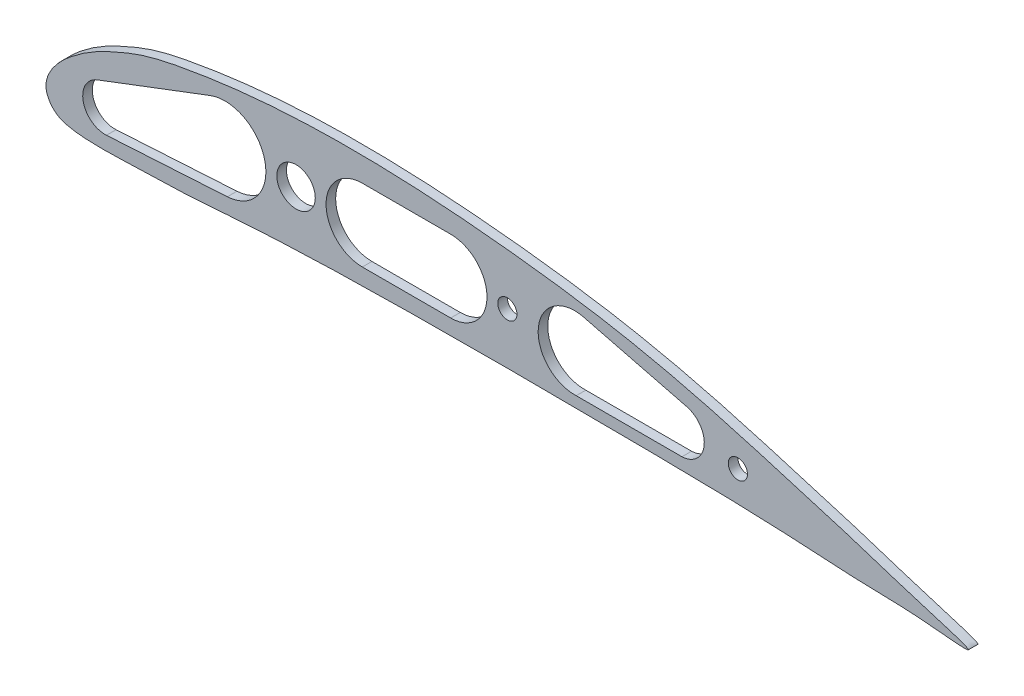
ISO-10303-21;
HEADER;
FILE_DESCRIPTION(('STEP AP214'),'2;1');
FILE_NAME('part.step','',(''),(''),'','','');
FILE_SCHEMA(('AUTOMOTIVE_DESIGN { 1 0 10303 214 1 1 1 1 }'));
ENDSEC;
DATA;
#1=APPLICATION_CONTEXT('core data for automotive mechanical design processes');
#2=APPLICATION_PROTOCOL_DEFINITION('international standard','automotive_design',2000,#1);
#3=PRODUCT_CONTEXT('',#1,'mechanical');
#4=PRODUCT('Part','Part','',(#3));
#5=PRODUCT_RELATED_PRODUCT_CATEGORY('part','',(#4));
#6=PRODUCT_DEFINITION_FORMATION('','',#4);
#7=PRODUCT_DEFINITION_CONTEXT('part definition',#1,'design');
#8=PRODUCT_DEFINITION('design','',#6,#7);
#9=PRODUCT_DEFINITION_SHAPE('','',#8);
#10=(LENGTH_UNIT() NAMED_UNIT(*) SI_UNIT(.MILLI.,.METRE.));
#11=(NAMED_UNIT(*) PLANE_ANGLE_UNIT() SI_UNIT($,.RADIAN.));
#12=(NAMED_UNIT(*) SI_UNIT($,.STERADIAN.) SOLID_ANGLE_UNIT());
#13=UNCERTAINTY_MEASURE_WITH_UNIT(LENGTH_MEASURE(1.E-05),#10,'distance_accuracy_value','');
#14=(GEOMETRIC_REPRESENTATION_CONTEXT(3) GLOBAL_UNCERTAINTY_ASSIGNED_CONTEXT((#13)) GLOBAL_UNIT_ASSIGNED_CONTEXT((#10,
#11,#12)) REPRESENTATION_CONTEXT('',''));
#15=CARTESIAN_POINT('',(0.,0.,0.));
#16=DIRECTION('',(0.,0.,1.));
#17=DIRECTION('',(1.,0.,0.));
#18=AXIS2_PLACEMENT_3D('',#15,#16,#17);
#19=CARTESIAN_POINT('',(304.8,0.,-1.5875));
#20=CARTESIAN_POINT('',(305.077640244681,0.670235949008001,-1.5875));
#21=CARTESIAN_POINT('',(287.206651557549,5.72014346783749,-1.5875));
#22=CARTESIAN_POINT('',(270.662795429074,11.3970544887587,-1.5875));
#23=CARTESIAN_POINT('',(243.463273841648,19.4859206004711,-1.5875));
#24=CARTESIAN_POINT('',(213.747912644984,28.2099572247865,-1.5875));
#25=CARTESIAN_POINT('',(183.040246215652,34.6765948811052,-1.5875));
#26=CARTESIAN_POINT('',(152.4919465254,38.6289899500206,-1.5875));
#27=CARTESIAN_POINT('',(121.966980876844,41.172895409398,-1.5875));
#28=CARTESIAN_POINT('',(91.4149280659883,41.7230127486465,-1.5875));
#29=CARTESIAN_POINT('',(65.9274954962046,40.0620135064187,-1.5875));
#30=CARTESIAN_POINT('',(45.6250038216973,37.0045999100277,-1.5875));
#31=CARTESIAN_POINT('',(32.7277103548807,34.3521427962271,-1.5875));
#32=CARTESIAN_POINT('',(22.7317956157464,30.1965290437229,-1.5875));
#33=CARTESIAN_POINT('',(14.9072257071245,26.4612505881115,-1.5875));
#34=CARTESIAN_POINT('',(8.51628352714233,21.9644178457254,-1.5875));
#35=CARTESIAN_POINT('',(2.53745558093638,16.4884644553953,-1.5875));
#36=CARTESIAN_POINT('',(-1.96447989389202,8.89390689304449,-1.5875));
#37=CARTESIAN_POINT('',(2.84193009807859,2.33492302764709,-1.5875));
#38=CARTESIAN_POINT('',(8.77882949074113,0.629027732179887,-1.5875));
#39=CARTESIAN_POINT('',(15.2287936628024,0.221834685012508,-1.5875));
#40=CARTESIAN_POINT('',(22.8635764639965,0.239109805904665,-1.5875));
#41=CARTESIAN_POINT('',(33.0156316728747,0.788100741553244,-1.5875));
#42=CARTESIAN_POINT('',(45.7404190780474,0.855312608130182,-1.5875));
#43=CARTESIAN_POINT('',(66.0183969786535,2.65839434977953,-1.5875));
#44=CARTESIAN_POINT('',(91.4265780864865,3.79492631367271,-1.5875));
#45=CARTESIAN_POINT('',(121.915270130211,4.33221739110161,-1.5875));
#46=CARTESIAN_POINT('',(152.408348669622,4.47906680792443,-1.5875));
#47=CARTESIAN_POINT('',(182.849810214161,4.26910364888094,-1.5875));
#48=CARTESIAN_POINT('',(213.479164171133,4.04767027141658,-1.5875));
#49=CARTESIAN_POINT('',(243.430144591887,3.31397178943146,-1.5875));
#50=CARTESIAN_POINT('',(270.486497521151,1.37051361290602,-1.5875));
#51=CARTESIAN_POINT('',(287.394329758651,1.44240402655394,-1.5875));
#52=CARTESIAN_POINT('',(304.536665056553,-0.635702313008765,-1.5875));
#53=CARTESIAN_POINT('',(304.8,0.,-1.5875));
#54=B_SPLINE_CURVE_WITH_KNOTS('',3,(#19,#20,#21,#22,#23,#24,#25,#26,#27,#28,#29,#30,#31,#32,#33,
#34,#35,#36,#37,#38,#39,#40,#41,#42,#43,#44,#45,#46,#47,#48,#49,#50,#51,#52,#53),.UNSPECIFIED.,
.T.,.F.,(4,1,1,1,1,1,1,1,1,1,1,1,1,1,1,1,1,1,1,1,1,1,1,1,1,1,1,1,1,1,1,1,4),(0.,
0.0255560444991772,0.050960447010779,0.101552747326171,0.151805437773323,0.201252492284918,
0.250083001864764,0.298629140589189,0.347026117124877,0.395536064294317,0.420002518911991,
0.444885367904301,0.457915186872697,0.47144103148067,0.486208379890319,0.494593530866719,
0.510948222410887,0.521394630718682,0.527823605666163,0.539981827808652,0.552079711007262,
0.564187268644203,0.588393920687583,0.612648894272303,0.661100878724036,0.709502088857399,
0.75789422654222,0.80628636422704,0.854680316537635,0.903093620624395,0.951545605076128,
0.975760720350009,1.),.UNSPECIFIED.);
#55=DIRECTION('',(0.,0.,1.));
#56=VECTOR('',#55,1.);
#57=SURFACE_OF_LINEAR_EXTRUSION('',#54,#56);
#58=CARTESIAN_POINT('',(304.8,0.,-1.5875));
#59=VERTEX_POINT('',#58);
#60=EDGE_CURVE('E12',#59,#59,#54,.T.);
#61=ORIENTED_EDGE('',*,*,#60,.T.);
#62=EDGE_LOOP('',(#61));
#63=FACE_BOUND('',#62,.T.);
#64=CARTESIAN_POINT('',(304.8,0.,1.5875));
#65=CARTESIAN_POINT('',(305.077640244681,0.670235949008001,1.5875));
#66=CARTESIAN_POINT('',(287.206651557549,5.72014346783749,1.5875));
#67=CARTESIAN_POINT('',(270.662795429074,11.3970544887587,1.5875));
#68=CARTESIAN_POINT('',(243.463273841648,19.4859206004711,1.5875));
#69=CARTESIAN_POINT('',(213.747912644984,28.2099572247865,1.5875));
#70=CARTESIAN_POINT('',(183.040246215652,34.6765948811052,1.5875));
#71=CARTESIAN_POINT('',(152.4919465254,38.6289899500206,1.5875));
#72=CARTESIAN_POINT('',(121.966980876844,41.172895409398,1.5875));
#73=CARTESIAN_POINT('',(91.4149280659883,41.7230127486465,1.5875));
#74=CARTESIAN_POINT('',(65.9274954962046,40.0620135064187,1.5875));
#75=CARTESIAN_POINT('',(45.6250038216973,37.0045999100277,1.5875));
#76=CARTESIAN_POINT('',(32.7277103548807,34.3521427962271,1.5875));
#77=CARTESIAN_POINT('',(22.7317956157464,30.1965290437229,1.5875));
#78=CARTESIAN_POINT('',(14.9072257071245,26.4612505881115,1.5875));
#79=CARTESIAN_POINT('',(8.51628352714233,21.9644178457254,1.5875));
#80=CARTESIAN_POINT('',(2.53745558093638,16.4884644553953,1.5875));
#81=CARTESIAN_POINT('',(-1.96447989389202,8.89390689304449,1.5875));
#82=CARTESIAN_POINT('',(2.84193009807859,2.33492302764709,1.5875));
#83=CARTESIAN_POINT('',(8.77882949074113,0.629027732179887,1.5875));
#84=CARTESIAN_POINT('',(15.2287936628024,0.221834685012508,1.5875));
#85=CARTESIAN_POINT('',(22.8635764639965,0.239109805904665,1.5875));
#86=CARTESIAN_POINT('',(33.0156316728747,0.788100741553244,1.5875));
#87=CARTESIAN_POINT('',(45.7404190780474,0.855312608130182,1.5875));
#88=CARTESIAN_POINT('',(66.0183969786535,2.65839434977953,1.5875));
#89=CARTESIAN_POINT('',(91.4265780864865,3.79492631367271,1.5875));
#90=CARTESIAN_POINT('',(121.915270130211,4.33221739110161,1.5875));
#91=CARTESIAN_POINT('',(152.408348669622,4.47906680792443,1.5875));
#92=CARTESIAN_POINT('',(182.849810214161,4.26910364888094,1.5875));
#93=CARTESIAN_POINT('',(213.479164171133,4.04767027141658,1.5875));
#94=CARTESIAN_POINT('',(243.430144591887,3.31397178943146,1.5875));
#95=CARTESIAN_POINT('',(270.486497521151,1.37051361290602,1.5875));
#96=CARTESIAN_POINT('',(287.394329758651,1.44240402655394,1.5875));
#97=CARTESIAN_POINT('',(304.536665056553,-0.635702313008765,1.5875));
#98=CARTESIAN_POINT('',(304.8,0.,1.5875));
#99=B_SPLINE_CURVE_WITH_KNOTS('',3,(#64,#65,#66,#67,#68,#69,#70,#71,#72,#73,#74,#75,#76,#77,#78,
#79,#80,#81,#82,#83,#84,#85,#86,#87,#88,#89,#90,#91,#92,#93,#94,#95,#96,#97,#98),.UNSPECIFIED.,
.T.,.F.,(4,1,1,1,1,1,1,1,1,1,1,1,1,1,1,1,1,1,1,1,1,1,1,1,1,1,1,1,1,1,1,1,4),(0.,
0.0255560444991772,0.050960447010779,0.101552747326171,0.151805437773323,0.201252492284918,
0.250083001864764,0.298629140589189,0.347026117124877,0.395536064294317,0.420002518911991,
0.444885367904301,0.457915186872697,0.47144103148067,0.486208379890319,0.494593530866719,
0.510948222410887,0.521394630718682,0.527823605666163,0.539981827808652,0.552079711007262,
0.564187268644203,0.588393920687583,0.612648894272303,0.661100878724036,0.709502088857399,
0.75789422654222,0.80628636422704,0.854680316537635,0.903093620624395,0.951545605076128,
0.975760720350009,1.),.UNSPECIFIED.);
#100=CARTESIAN_POINT('',(304.8,0.,1.5875));
#101=VERTEX_POINT('',#100);
#102=EDGE_CURVE('E299',#101,#101,#99,.T.);
#103=ORIENTED_EDGE('',*,*,#102,.F.);
#104=EDGE_LOOP('',(#103));
#105=FACE_BOUND('',#104,.T.);
#106=ADVANCED_FACE('F103',(#63,#105),#57,.T.);
#107=CARTESIAN_POINT('',(1.65605512116519,14.4639878907678,-1.5875));
#108=DIRECTION('',(0.,0.,-1.));
#109=DIRECTION('',(-1.,0.,0.));
#110=AXIS2_PLACEMENT_3D('',#107,#108,#109);
#111=PLANE('',#110);
#112=CARTESIAN_POINT('',(19.4354022409776,12.2377464236183,-1.58750000000001));
#113=DIRECTION('',(0.,0.,-1.));
#114=DIRECTION('',(-1.,0.,0.));
#115=AXIS2_PLACEMENT_3D('',#112,#113,#114);
#116=CIRCLE('',#115,7.41096594490253);
#117=CARTESIAN_POINT('',(19.873308784363,4.83972952070675,-1.58750000000001));
#118=VERTEX_POINT('',#117);
#119=CARTESIAN_POINT('',(16.8041816122865,19.1658842859631,-1.58750000000001));
#120=VERTEX_POINT('',#119);
#121=EDGE_CURVE('E288',#118,#120,#116,.T.);
#122=ORIENTED_EDGE('',*,*,#121,.F.);
#123=DIRECTION('',(-0.998252718729619,-0.0590889968515594,0.));
#124=VECTOR('',#123,1.);
#125=CARTESIAN_POINT('',(2.28735495131891,3.79877430848873,-1.5875));
#126=LINE('',#125,#124);
#127=CARTESIAN_POINT('',(59.832894926961,7.20503423309905,-1.5875));
#128=VERTEX_POINT('',#127);
#129=EDGE_CURVE('E282',#128,#118,#126,.T.);
#130=ORIENTED_EDGE('',*,*,#129,.F.);
#131=CARTESIAN_POINT('',(59.0328635687362,20.7208074052714,-1.58750000000001));
#132=DIRECTION('',(0.,0.,-1.));
#133=DIRECTION('',(-1.,0.,0.));
#134=AXIS2_PLACEMENT_3D('',#131,#132,#133);
#135=CIRCLE('',#134,13.5394303652612);
#136=CARTESIAN_POINT('',(54.225767065708,33.3781372116063,-1.58750000000001));
#137=VERTEX_POINT('',#136);
#138=EDGE_CURVE('E199',#137,#128,#135,.T.);
#139=ORIENTED_EDGE('',*,*,#138,.F.);
#140=DIRECTION('',(-0.934849507318296,-0.355044220720096,0.));
#141=VECTOR('',#140,1.);
#142=CARTESIAN_POINT('',(2.00495325549025,13.5453213418052,-1.5875));
#143=LINE('',#142,#141);
#144=EDGE_CURVE('E285',#137,#120,#143,.T.);
#145=ORIENTED_EDGE('',*,*,#144,.T.);
#146=EDGE_LOOP('',(#122,#130,#139,#145));
#147=FACE_BOUND('',#146,.T.);
#148=CARTESIAN_POINT('',(104.457500000008,21.4122000122882,-1.58750000000001));
#149=DIRECTION('',(0.,0.,-1.));
#150=DIRECTION('',(-1.,0.,0.));
#151=AXIS2_PLACEMENT_3D('',#148,#149,#150);
#152=CIRCLE('',#151,11.9939854368826);
#153=CARTESIAN_POINT('',(104.457500000008,9.41821457540554,-1.58750000000001));
#154=VERTEX_POINT('',#153);
#155=CARTESIAN_POINT('',(104.457500000008,33.4061854491708,-1.58750000000001));
#156=VERTEX_POINT('',#155);
#157=EDGE_CURVE('E280',#154,#156,#152,.T.);
#158=ORIENTED_EDGE('',*,*,#157,.F.);
#159=DIRECTION('',(-1.,0.,0.));
#160=VECTOR('',#159,1.);
#161=CARTESIAN_POINT('',(1.65605512116519,9.41821457540554,-1.5875));
#162=LINE('',#161,#160);
#163=CARTESIAN_POINT('',(133.667500000008,9.41821457540554,-1.5875));
#164=VERTEX_POINT('',#163);
#165=EDGE_CURVE('E273',#164,#154,#162,.T.);
#166=ORIENTED_EDGE('',*,*,#165,.F.);
#167=CARTESIAN_POINT('',(133.667500000008,21.4122000122882,-1.58750000000001));
#168=DIRECTION('',(0.,0.,-1.));
#169=DIRECTION('',(-1.,0.,0.));
#170=AXIS2_PLACEMENT_3D('',#167,#168,#169);
#171=CIRCLE('',#170,11.9939854368826);
#172=CARTESIAN_POINT('',(133.667500000008,33.4061854491708,-1.58750000000001));
#173=VERTEX_POINT('',#172);
#174=EDGE_CURVE('E275',#173,#164,#171,.T.);
#175=ORIENTED_EDGE('',*,*,#174,.F.);
#176=DIRECTION('',(-1.,0.,0.));
#177=VECTOR('',#176,1.);
#178=CARTESIAN_POINT('',(1.65605512116519,33.4061854491708,-1.5875));
#179=LINE('',#178,#177);
#180=EDGE_CURVE('E277',#173,#156,#179,.T.);
#181=ORIENTED_EDGE('',*,*,#180,.T.);
#182=EDGE_LOOP('',(#158,#166,#175,#181));
#183=FACE_BOUND('',#182,.T.);
#184=CARTESIAN_POINT('',(209.808003176816,15.6054460212377,-1.58750000000001));
#185=DIRECTION('',(0.,0.,-1.));
#186=DIRECTION('',(-1.,0.,0.));
#187=AXIS2_PLACEMENT_3D('',#184,#185,#186);
#188=CIRCLE('',#187,7.68856401570672);
#189=CARTESIAN_POINT('',(211.502653030094,23.1049245696704,-1.58750000000001));
#190=VERTEX_POINT('',#189);
#191=CARTESIAN_POINT('',(210.117140630324,7.92309933168644,-1.58750000000001));
#192=VERTEX_POINT('',#191);
#193=EDGE_CURVE('E271',#190,#192,#188,.T.);
#194=ORIENTED_EDGE('',*,*,#193,.F.);
#195=DIRECTION('',(-0.969716951507076,0.244231517130414,0.));
#196=VECTOR('',#195,1.);
#197=CARTESIAN_POINT('',(16.2196820260221,72.2886128654517,-1.5875));
#198=LINE('',#197,#196);
#199=CARTESIAN_POINT('',(177.575712719269,31.649714975601,-1.5875));
#200=VERTEX_POINT('',#199);
#201=EDGE_CURVE('E223',#190,#200,#198,.T.);
#202=ORIENTED_EDGE('',*,*,#201,.T.);
#203=CARTESIAN_POINT('',(174.632313846248,19.9630014189328,-1.58750000000001));
#204=DIRECTION('',(0.,0.,-1.));
#205=DIRECTION('',(-1.,0.,0.));
#206=AXIS2_PLACEMENT_3D('',#203,#204,#205);
#207=CIRCLE('',#206,12.0516750155869);
#208=CARTESIAN_POINT('',(175.164881598606,7.92309933168679,-1.58750000000001));
#209=VERTEX_POINT('',#208);
#210=EDGE_CURVE('E266',#209,#200,#207,.T.);
#211=ORIENTED_EDGE('',*,*,#210,.F.);
#212=DIRECTION('',(-1.,0.,0.));
#213=VECTOR('',#212,1.);
#214=CARTESIAN_POINT('',(1.65605512116519,7.92309933168644,-1.5875));
#215=LINE('',#214,#213);
#216=EDGE_CURVE('E269',#192,#209,#215,.T.);
#217=ORIENTED_EDGE('',*,*,#216,.F.);
#218=EDGE_LOOP('',(#194,#202,#211,#217));
#219=FACE_BOUND('',#218,.T.);
#220=CARTESIAN_POINT('',(152.4,21.4122000122836,-1.5875));
#221=DIRECTION('',(0.,0.,1.));
#222=DIRECTION('',(1.,0.,0.));
#223=AXIS2_PLACEMENT_3D('',#220,#221,#222);
#224=CIRCLE('',#223,3.175);
#225=CARTESIAN_POINT('',(155.575,21.4122000122836,-1.5875));
#226=VERTEX_POINT('',#225);
#227=EDGE_CURVE('E304',#226,#226,#224,.T.);
#228=ORIENTED_EDGE('',*,*,#227,.T.);
#229=EDGE_LOOP('',(#228));
#230=FACE_BOUND('',#229,.T.);
#231=CARTESIAN_POINT('',(228.6,13.7136378450758,-1.5875));
#232=DIRECTION('',(0.,0.,1.));
#233=DIRECTION('',(1.,0.,0.));
#234=AXIS2_PLACEMENT_3D('',#231,#232,#233);
#235=CIRCLE('',#234,3.175);
#236=CARTESIAN_POINT('',(231.775,13.7136378450758,-1.5875));
#237=VERTEX_POINT('',#236);
#238=EDGE_CURVE('E310',#237,#237,#235,.T.);
#239=ORIENTED_EDGE('',*,*,#238,.T.);
#240=EDGE_LOOP('',(#239));
#241=FACE_BOUND('',#240,.T.);
#242=CARTESIAN_POINT('',(82.5499999999988,21.4122000122836,-1.5875));
#243=DIRECTION('',(0.,0.,1.));
#244=DIRECTION('',(1.,0.,0.));
#245=AXIS2_PLACEMENT_3D('',#242,#243,#244);
#246=CIRCLE('',#245,6.35);
#247=CARTESIAN_POINT('',(88.8999999999988,21.4122000122836,-1.5875));
#248=VERTEX_POINT('',#247);
#249=EDGE_CURVE('E113',#248,#248,#246,.T.);
#250=ORIENTED_EDGE('',*,*,#249,.T.);
#251=EDGE_LOOP('',(#250));
#252=FACE_BOUND('',#251,.T.);
#253=ORIENTED_EDGE('',*,*,#60,.F.);
#254=EDGE_LOOP('',(#253));
#255=FACE_BOUND('',#254,.T.);
#256=ADVANCED_FACE('F315',(#147,#183,#219,#230,#241,#252,#255),#111,.T.);
#257=CARTESIAN_POINT('',(82.5499999999988,21.4122000122836,-1.5875));
#258=DIRECTION('',(0.,0.,1.));
#259=DIRECTION('',(1.,0.,0.));
#260=AXIS2_PLACEMENT_3D('',#257,#258,#259);
#261=CYLINDRICAL_SURFACE('',#260,6.35);
#262=ORIENTED_EDGE('',*,*,#249,.F.);
#263=EDGE_LOOP('',(#262));
#264=FACE_BOUND('',#263,.T.);
#265=CARTESIAN_POINT('',(82.5499999999988,21.4122000122836,1.5875));
#266=DIRECTION('',(0.,0.,1.));
#267=DIRECTION('',(1.,0.,0.));
#268=AXIS2_PLACEMENT_3D('',#265,#266,#267);
#269=CIRCLE('',#268,6.35);
#270=CARTESIAN_POINT('',(88.8999999999988,21.4122000122836,1.5875));
#271=VERTEX_POINT('',#270);
#272=EDGE_CURVE('E296',#271,#271,#269,.T.);
#273=ORIENTED_EDGE('',*,*,#272,.T.);
#274=EDGE_LOOP('',(#273));
#275=FACE_BOUND('',#274,.T.);
#276=ADVANCED_FACE('F318',(#264,#275),#261,.F.);
#277=CARTESIAN_POINT('',(228.6,13.7136378450758,-1.5875));
#278=DIRECTION('',(0.,0.,1.));
#279=DIRECTION('',(1.,0.,0.));
#280=AXIS2_PLACEMENT_3D('',#277,#278,#279);
#281=CYLINDRICAL_SURFACE('',#280,3.175);
#282=ORIENTED_EDGE('',*,*,#238,.F.);
#283=EDGE_LOOP('',(#282));
#284=FACE_BOUND('',#283,.T.);
#285=CARTESIAN_POINT('',(228.6,13.7136378450758,1.5875));
#286=DIRECTION('',(0.,0.,1.));
#287=DIRECTION('',(1.,0.,0.));
#288=AXIS2_PLACEMENT_3D('',#285,#286,#287);
#289=CIRCLE('',#288,3.175);
#290=CARTESIAN_POINT('',(231.775,13.7136378450758,1.5875));
#291=VERTEX_POINT('',#290);
#292=EDGE_CURVE('E293',#291,#291,#289,.T.);
#293=ORIENTED_EDGE('',*,*,#292,.T.);
#294=EDGE_LOOP('',(#293));
#295=FACE_BOUND('',#294,.T.);
#296=ADVANCED_FACE('F321',(#284,#295),#281,.F.);
#297=CARTESIAN_POINT('',(152.4,21.4122000122836,-1.5875));
#298=DIRECTION('',(0.,0.,1.));
#299=DIRECTION('',(1.,0.,0.));
#300=AXIS2_PLACEMENT_3D('',#297,#298,#299);
#301=CYLINDRICAL_SURFACE('',#300,3.175);
#302=ORIENTED_EDGE('',*,*,#227,.F.);
#303=EDGE_LOOP('',(#302));
#304=FACE_BOUND('',#303,.T.);
#305=CARTESIAN_POINT('',(152.4,21.4122000122836,1.5875));
#306=DIRECTION('',(0.,0.,1.));
#307=DIRECTION('',(1.,0.,0.));
#308=AXIS2_PLACEMENT_3D('',#305,#306,#307);
#309=CIRCLE('',#308,3.175);
#310=CARTESIAN_POINT('',(155.575,21.4122000122836,1.5875));
#311=VERTEX_POINT('',#310);
#312=EDGE_CURVE('E290',#311,#311,#309,.T.);
#313=ORIENTED_EDGE('',*,*,#312,.T.);
#314=EDGE_LOOP('',(#313));
#315=FACE_BOUND('',#314,.T.);
#316=ADVANCED_FACE('F328',(#304,#315),#301,.F.);
#317=CARTESIAN_POINT('',(1.65605512116519,14.4639878907678,1.5875));
#318=DIRECTION('',(0.,0.,-1.));
#319=DIRECTION('',(-1.,0.,0.));
#320=AXIS2_PLACEMENT_3D('',#317,#318,#319);
#321=PLANE('',#320);
#322=DIRECTION('',(0.998252718729619,0.0590889968515594,0.));
#323=VECTOR('',#322,1.);
#324=CARTESIAN_POINT('',(19.873308784363,4.83972952070675,1.5875));
#325=LINE('',#324,#323);
#326=CARTESIAN_POINT('',(19.873308784363,4.83972952070675,1.5875));
#327=VERTEX_POINT('',#326);
#328=CARTESIAN_POINT('',(59.832894926961,7.20503423309905,1.5875));
#329=VERTEX_POINT('',#328);
#330=EDGE_CURVE('E206',#327,#329,#325,.T.);
#331=ORIENTED_EDGE('',*,*,#330,.F.);
#332=CARTESIAN_POINT('',(19.4354022409776,12.2377464236183,1.5875));
#333=DIRECTION('',(0.,0.,1.));
#334=DIRECTION('',(1.,0.,0.));
#335=AXIS2_PLACEMENT_3D('',#332,#333,#334);
#336=CIRCLE('',#335,7.41096594490253);
#337=CARTESIAN_POINT('',(16.8041816122865,19.1658842859631,1.5875));
#338=VERTEX_POINT('',#337);
#339=EDGE_CURVE('E211',#338,#327,#336,.T.);
#340=ORIENTED_EDGE('',*,*,#339,.F.);
#341=DIRECTION('',(0.934849507318295,0.355044220720096,0.));
#342=VECTOR('',#341,1.);
#343=CARTESIAN_POINT('',(16.8041816122865,19.1658842859631,1.5875));
#344=LINE('',#343,#342);
#345=CARTESIAN_POINT('',(54.225767065708,33.3781372116063,1.5875));
#346=VERTEX_POINT('',#345);
#347=EDGE_CURVE('E216',#338,#346,#344,.T.);
#348=ORIENTED_EDGE('',*,*,#347,.T.);
#349=CARTESIAN_POINT('',(59.0328635687362,20.7208074052714,1.5875));
#350=DIRECTION('',(0.,0.,1.));
#351=DIRECTION('',(1.,0.,0.));
#352=AXIS2_PLACEMENT_3D('',#349,#350,#351);
#353=CIRCLE('',#352,13.5394303652612);
#354=EDGE_CURVE('E196',#329,#346,#353,.T.);
#355=ORIENTED_EDGE('',*,*,#354,.F.);
#356=EDGE_LOOP('',(#331,#340,#348,#355));
#357=FACE_BOUND('',#356,.T.);
#358=DIRECTION('',(1.,0.,0.));
#359=VECTOR('',#358,1.);
#360=CARTESIAN_POINT('',(104.457500000008,9.41821457540554,1.5875));
#361=LINE('',#360,#359);
#362=CARTESIAN_POINT('',(104.457500000008,9.41821457540554,1.5875));
#363=VERTEX_POINT('',#362);
#364=CARTESIAN_POINT('',(133.667500000008,9.41821457540553,1.5875));
#365=VERTEX_POINT('',#364);
#366=EDGE_CURVE('E241',#363,#365,#361,.T.);
#367=ORIENTED_EDGE('',*,*,#366,.F.);
#368=CARTESIAN_POINT('',(104.457500000008,21.4122000122882,1.5875));
#369=DIRECTION('',(0.,0.,1.));
#370=DIRECTION('',(1.,0.,0.));
#371=AXIS2_PLACEMENT_3D('',#368,#369,#370);
#372=CIRCLE('',#371,11.9939854368826);
#373=CARTESIAN_POINT('',(104.457500000008,33.4061854491708,1.5875));
#374=VERTEX_POINT('',#373);
#375=EDGE_CURVE('E243',#374,#363,#372,.T.);
#376=ORIENTED_EDGE('',*,*,#375,.F.);
#377=DIRECTION('',(1.,0.,0.));
#378=VECTOR('',#377,1.);
#379=CARTESIAN_POINT('',(104.457500000008,33.4061854491708,1.5875));
#380=LINE('',#379,#378);
#381=CARTESIAN_POINT('',(133.667500000008,33.4061854491708,1.5875));
#382=VERTEX_POINT('',#381);
#383=EDGE_CURVE('E229',#374,#382,#380,.T.);
#384=ORIENTED_EDGE('',*,*,#383,.T.);
#385=CARTESIAN_POINT('',(133.667500000008,21.4122000122882,1.5875));
#386=DIRECTION('',(0.,0.,1.));
#387=DIRECTION('',(1.,0.,0.));
#388=AXIS2_PLACEMENT_3D('',#385,#386,#387);
#389=CIRCLE('',#388,11.9939854368826);
#390=EDGE_CURVE('E238',#365,#382,#389,.T.);
#391=ORIENTED_EDGE('',*,*,#390,.F.);
#392=EDGE_LOOP('',(#367,#376,#384,#391));
#393=FACE_BOUND('',#392,.T.);
#394=DIRECTION('',(0.969716951507076,-0.244231517130414,0.));
#395=VECTOR('',#394,1.);
#396=CARTESIAN_POINT('',(177.575712719269,31.649714975601,1.5875));
#397=LINE('',#396,#395);
#398=CARTESIAN_POINT('',(177.575712719269,31.649714975601,1.5875));
#399=VERTEX_POINT('',#398);
#400=CARTESIAN_POINT('',(211.502653030094,23.1049245696704,1.5875));
#401=VERTEX_POINT('',#400);
#402=EDGE_CURVE('E260',#399,#401,#397,.T.);
#403=ORIENTED_EDGE('',*,*,#402,.T.);
#404=CARTESIAN_POINT('',(209.808003176816,15.6054460212377,1.5875));
#405=DIRECTION('',(0.,0.,1.));
#406=DIRECTION('',(1.,0.,0.));
#407=AXIS2_PLACEMENT_3D('',#404,#405,#406);
#408=CIRCLE('',#407,7.68856401570672);
#409=CARTESIAN_POINT('',(210.117140630324,7.92309933168644,1.5875));
#410=VERTEX_POINT('',#409);
#411=EDGE_CURVE('E235',#410,#401,#408,.T.);
#412=ORIENTED_EDGE('',*,*,#411,.F.);
#413=DIRECTION('',(1.,0.,0.));
#414=VECTOR('',#413,1.);
#415=CARTESIAN_POINT('',(175.164881598606,7.92309933168644,1.5875));
#416=LINE('',#415,#414);
#417=CARTESIAN_POINT('',(175.164881598606,7.92309933168679,1.5875));
#418=VERTEX_POINT('',#417);
#419=EDGE_CURVE('E248',#418,#410,#416,.T.);
#420=ORIENTED_EDGE('',*,*,#419,.F.);
#421=CARTESIAN_POINT('',(174.632313846248,19.9630014189328,1.5875));
#422=DIRECTION('',(0.,0.,1.));
#423=DIRECTION('',(1.,0.,0.));
#424=AXIS2_PLACEMENT_3D('',#421,#422,#423);
#425=CIRCLE('',#424,12.0516750155869);
#426=EDGE_CURVE('E257',#399,#418,#425,.T.);
#427=ORIENTED_EDGE('',*,*,#426,.F.);
#428=EDGE_LOOP('',(#403,#412,#420,#427));
#429=FACE_BOUND('',#428,.T.);
#430=ORIENTED_EDGE('',*,*,#102,.T.);
#431=EDGE_LOOP('',(#430));
#432=FACE_BOUND('',#431,.T.);
#433=ORIENTED_EDGE('',*,*,#272,.F.);
#434=EDGE_LOOP('',(#433));
#435=FACE_BOUND('',#434,.T.);
#436=ORIENTED_EDGE('',*,*,#292,.F.);
#437=EDGE_LOOP('',(#436));
#438=FACE_BOUND('',#437,.T.);
#439=ORIENTED_EDGE('',*,*,#312,.F.);
#440=EDGE_LOOP('',(#439));
#441=FACE_BOUND('',#440,.T.);
#442=ADVANCED_FACE('F213',(#357,#393,#429,#432,#435,#438,#441),#321,.F.);
#443=CARTESIAN_POINT('',(209.808003176816,15.6054460212377,-81.7245));
#444=DIRECTION('',(0.,0.,1.));
#445=DIRECTION('',(1.,0.,0.));
#446=AXIS2_PLACEMENT_3D('',#443,#444,#445);
#447=CYLINDRICAL_SURFACE('',#446,7.68856401570672);
#448=ORIENTED_EDGE('',*,*,#193,.T.);
#449=DIRECTION('',(0.,0.,1.));
#450=VECTOR('',#449,1.);
#451=CARTESIAN_POINT('',(210.117140630324,7.92309933168644,-81.7245));
#452=LINE('',#451,#450);
#453=EDGE_CURVE('E253',#192,#410,#452,.T.);
#454=ORIENTED_EDGE('',*,*,#453,.T.);
#455=ORIENTED_EDGE('',*,*,#411,.T.);
#456=DIRECTION('',(0.,0.,1.));
#457=VECTOR('',#456,1.);
#458=CARTESIAN_POINT('',(211.502653030094,23.1049245696704,-81.7245));
#459=LINE('',#458,#457);
#460=EDGE_CURVE('E245',#190,#401,#459,.T.);
#461=ORIENTED_EDGE('',*,*,#460,.F.);
#462=EDGE_LOOP('',(#448,#454,#455,#461));
#463=FACE_BOUND('',#462,.T.);
#464=ADVANCED_FACE('F327',(#463),#447,.F.);
#465=CARTESIAN_POINT('',(175.164881598606,7.92309933168644,-81.7245));
#466=DIRECTION('',(0.,-1.,0.));
#467=DIRECTION('',(0.,0.,-1.));
#468=AXIS2_PLACEMENT_3D('',#465,#466,#467);
#469=PLANE('',#468);
#470=ORIENTED_EDGE('',*,*,#216,.T.);
#471=DIRECTION('',(0.,0.,1.));
#472=VECTOR('',#471,1.);
#473=CARTESIAN_POINT('',(175.164881598606,7.92309933168679,-81.7245));
#474=LINE('',#473,#472);
#475=EDGE_CURVE('E251',#209,#418,#474,.T.);
#476=ORIENTED_EDGE('',*,*,#475,.T.);
#477=ORIENTED_EDGE('',*,*,#419,.T.);
#478=ORIENTED_EDGE('',*,*,#453,.F.);
#479=EDGE_LOOP('',(#470,#476,#477,#478));
#480=FACE_BOUND('',#479,.T.);
#481=ADVANCED_FACE('F371',(#480),#469,.F.);
#482=CARTESIAN_POINT('',(174.632313846248,19.9630014189328,-81.7245));
#483=DIRECTION('',(0.,0.,1.));
#484=DIRECTION('',(1.,0.,0.));
#485=AXIS2_PLACEMENT_3D('',#482,#483,#484);
#486=CYLINDRICAL_SURFACE('',#485,12.0516750155869);
#487=ORIENTED_EDGE('',*,*,#210,.T.);
#488=DIRECTION('',(0.,0.,1.));
#489=VECTOR('',#488,1.);
#490=CARTESIAN_POINT('',(177.575712719269,31.649714975601,-81.7245));
#491=LINE('',#490,#489);
#492=EDGE_CURVE('E249',#200,#399,#491,.T.);
#493=ORIENTED_EDGE('',*,*,#492,.T.);
#494=ORIENTED_EDGE('',*,*,#426,.T.);
#495=ORIENTED_EDGE('',*,*,#475,.F.);
#496=EDGE_LOOP('',(#487,#493,#494,#495));
#497=FACE_BOUND('',#496,.T.);
#498=ADVANCED_FACE('F381',(#497),#486,.F.);
#499=CARTESIAN_POINT('',(177.575712719269,31.649714975601,-81.7245));
#500=DIRECTION('',(-0.244231517130414,-0.969716951507076,0.));
#501=DIRECTION('',(0.969716951507076,-0.244231517130414,0.));
#502=AXIS2_PLACEMENT_3D('',#499,#500,#501);
#503=PLANE('',#502);
#504=ORIENTED_EDGE('',*,*,#460,.T.);
#505=ORIENTED_EDGE('',*,*,#402,.F.);
#506=ORIENTED_EDGE('',*,*,#492,.F.);
#507=ORIENTED_EDGE('',*,*,#201,.F.);
#508=EDGE_LOOP('',(#504,#505,#506,#507));
#509=FACE_BOUND('',#508,.T.);
#510=ADVANCED_FACE('F379',(#509),#503,.T.);
#511=CARTESIAN_POINT('',(104.457500000008,21.4122000122882,-81.7245));
#512=DIRECTION('',(0.,0.,1.));
#513=DIRECTION('',(1.,0.,0.));
#514=AXIS2_PLACEMENT_3D('',#511,#512,#513);
#515=CYLINDRICAL_SURFACE('',#514,11.9939854368826);
#516=ORIENTED_EDGE('',*,*,#157,.T.);
#517=DIRECTION('',(0.,0.,1.));
#518=VECTOR('',#517,1.);
#519=CARTESIAN_POINT('',(104.457500000008,33.4061854491708,-81.7245));
#520=LINE('',#519,#518);
#521=EDGE_CURVE('E233',#156,#374,#520,.T.);
#522=ORIENTED_EDGE('',*,*,#521,.T.);
#523=ORIENTED_EDGE('',*,*,#375,.T.);
#524=DIRECTION('',(0.,0.,1.));
#525=VECTOR('',#524,1.);
#526=CARTESIAN_POINT('',(104.457500000008,9.41821457540554,-81.7245));
#527=LINE('',#526,#525);
#528=EDGE_CURVE('E226',#154,#363,#527,.T.);
#529=ORIENTED_EDGE('',*,*,#528,.F.);
#530=EDGE_LOOP('',(#516,#522,#523,#529));
#531=FACE_BOUND('',#530,.T.);
#532=ADVANCED_FACE('F388',(#531),#515,.F.);
#533=CARTESIAN_POINT('',(104.457500000008,33.4061854491708,-81.7245));
#534=DIRECTION('',(0.,-1.,0.));
#535=DIRECTION('',(0.,0.,-1.));
#536=AXIS2_PLACEMENT_3D('',#533,#534,#535);
#537=PLANE('',#536);
#538=DIRECTION('',(0.,0.,1.));
#539=VECTOR('',#538,1.);
#540=CARTESIAN_POINT('',(133.667500000008,33.4061854491708,-81.7245));
#541=LINE('',#540,#539);
#542=EDGE_CURVE('E231',#173,#382,#541,.T.);
#543=ORIENTED_EDGE('',*,*,#542,.T.);
#544=ORIENTED_EDGE('',*,*,#383,.F.);
#545=ORIENTED_EDGE('',*,*,#521,.F.);
#546=ORIENTED_EDGE('',*,*,#180,.F.);
#547=EDGE_LOOP('',(#543,#544,#545,#546));
#548=FACE_BOUND('',#547,.T.);
#549=ADVANCED_FACE('F394',(#548),#537,.T.);
#550=CARTESIAN_POINT('',(133.667500000008,21.4122000122882,-81.7245));
#551=DIRECTION('',(0.,0.,1.));
#552=DIRECTION('',(1.,0.,0.));
#553=AXIS2_PLACEMENT_3D('',#550,#551,#552);
#554=CYLINDRICAL_SURFACE('',#553,11.9939854368826);
#555=ORIENTED_EDGE('',*,*,#174,.T.);
#556=DIRECTION('',(0.,0.,1.));
#557=VECTOR('',#556,1.);
#558=CARTESIAN_POINT('',(133.667500000008,9.41821457540553,-81.7245));
#559=LINE('',#558,#557);
#560=EDGE_CURVE('E128',#164,#365,#559,.T.);
#561=ORIENTED_EDGE('',*,*,#560,.T.);
#562=ORIENTED_EDGE('',*,*,#390,.T.);
#563=ORIENTED_EDGE('',*,*,#542,.F.);
#564=EDGE_LOOP('',(#555,#561,#562,#563));
#565=FACE_BOUND('',#564,.T.);
#566=ADVANCED_FACE('F397',(#565),#554,.F.);
#567=CARTESIAN_POINT('',(104.457500000008,9.41821457540554,-81.7245));
#568=DIRECTION('',(0.,-1.,0.));
#569=DIRECTION('',(0.,0.,-1.));
#570=AXIS2_PLACEMENT_3D('',#567,#568,#569);
#571=PLANE('',#570);
#572=ORIENTED_EDGE('',*,*,#165,.T.);
#573=ORIENTED_EDGE('',*,*,#528,.T.);
#574=ORIENTED_EDGE('',*,*,#366,.T.);
#575=ORIENTED_EDGE('',*,*,#560,.F.);
#576=EDGE_LOOP('',(#572,#573,#574,#575));
#577=FACE_BOUND('',#576,.T.);
#578=ADVANCED_FACE('F401',(#577),#571,.F.);
#579=CARTESIAN_POINT('',(19.4354022409776,12.2377464236183,-81.7245));
#580=DIRECTION('',(0.,0.,1.));
#581=DIRECTION('',(1.,0.,0.));
#582=AXIS2_PLACEMENT_3D('',#579,#580,#581);
#583=CYLINDRICAL_SURFACE('',#582,7.41096594490253);
#584=ORIENTED_EDGE('',*,*,#121,.T.);
#585=DIRECTION('',(0.,0.,1.));
#586=VECTOR('',#585,1.);
#587=CARTESIAN_POINT('',(16.8041816122865,19.1658842859631,-81.7245));
#588=LINE('',#587,#586);
#589=EDGE_CURVE('E221',#120,#338,#588,.T.);
#590=ORIENTED_EDGE('',*,*,#589,.T.);
#591=ORIENTED_EDGE('',*,*,#339,.T.);
#592=DIRECTION('',(0.,0.,1.));
#593=VECTOR('',#592,1.);
#594=CARTESIAN_POINT('',(19.873308784363,4.83972952070675,-81.7245));
#595=LINE('',#594,#593);
#596=EDGE_CURVE('E202',#118,#327,#595,.T.);
#597=ORIENTED_EDGE('',*,*,#596,.F.);
#598=EDGE_LOOP('',(#584,#590,#591,#597));
#599=FACE_BOUND('',#598,.T.);
#600=ADVANCED_FACE('F405',(#599),#583,.F.);
#601=CARTESIAN_POINT('',(16.8041816122865,19.1658842859631,-81.7245));
#602=DIRECTION('',(0.355044220720096,-0.934849507318295,0.));
#603=DIRECTION('',(0.934849507318296,0.355044220720096,0.));
#604=AXIS2_PLACEMENT_3D('',#601,#602,#603);
#605=PLANE('',#604);
#606=DIRECTION('',(0.,0.,1.));
#607=VECTOR('',#606,1.);
#608=CARTESIAN_POINT('',(54.225767065708,33.3781372116063,-81.7245));
#609=LINE('',#608,#607);
#610=EDGE_CURVE('E201',#137,#346,#609,.T.);
#611=ORIENTED_EDGE('',*,*,#610,.T.);
#612=ORIENTED_EDGE('',*,*,#347,.F.);
#613=ORIENTED_EDGE('',*,*,#589,.F.);
#614=ORIENTED_EDGE('',*,*,#144,.F.);
#615=EDGE_LOOP('',(#611,#612,#613,#614));
#616=FACE_BOUND('',#615,.T.);
#617=ADVANCED_FACE('F411',(#616),#605,.T.);
#618=CARTESIAN_POINT('',(59.0328635687362,20.7208074052714,-81.7245));
#619=DIRECTION('',(0.,0.,1.));
#620=DIRECTION('',(1.,0.,0.));
#621=AXIS2_PLACEMENT_3D('',#618,#619,#620);
#622=CYLINDRICAL_SURFACE('',#621,13.5394303652612);
#623=ORIENTED_EDGE('',*,*,#138,.T.);
#624=DIRECTION('',(0.,0.,1.));
#625=VECTOR('',#624,1.);
#626=CARTESIAN_POINT('',(59.832894926961,7.20503423309905,-81.7245));
#627=LINE('',#626,#625);
#628=EDGE_CURVE('E120',#128,#329,#627,.T.);
#629=ORIENTED_EDGE('',*,*,#628,.T.);
#630=ORIENTED_EDGE('',*,*,#354,.T.);
#631=ORIENTED_EDGE('',*,*,#610,.F.);
#632=EDGE_LOOP('',(#623,#629,#630,#631));
#633=FACE_BOUND('',#632,.T.);
#634=ADVANCED_FACE('F193',(#633),#622,.F.);
#635=CARTESIAN_POINT('',(19.873308784363,4.83972952070675,-81.7245));
#636=DIRECTION('',(0.0590889968515594,-0.998252718729619,0.));
#637=DIRECTION('',(0.998252718729619,0.0590889968515594,0.));
#638=AXIS2_PLACEMENT_3D('',#635,#636,#637);
#639=PLANE('',#638);
#640=ORIENTED_EDGE('',*,*,#129,.T.);
#641=ORIENTED_EDGE('',*,*,#596,.T.);
#642=ORIENTED_EDGE('',*,*,#330,.T.);
#643=ORIENTED_EDGE('',*,*,#628,.F.);
#644=EDGE_LOOP('',(#640,#641,#642,#643));
#645=FACE_BOUND('',#644,.T.);
#646=ADVANCED_FACE('F207',(#645),#639,.F.);
#647=CLOSED_SHELL('',(#106,#256,#276,#296,#316,#442,#464,#481,#498,#510,#532,#549,#566,#578,
#600,#617,#634,#646));
#648=MANIFOLD_SOLID_BREP('B2',#647);
#649=ADVANCED_BREP_SHAPE_REPRESENTATION('',(#18,#648),#14);
#650=SHAPE_DEFINITION_REPRESENTATION(#9,#649);
ENDSEC;
END-ISO-10303-21;
